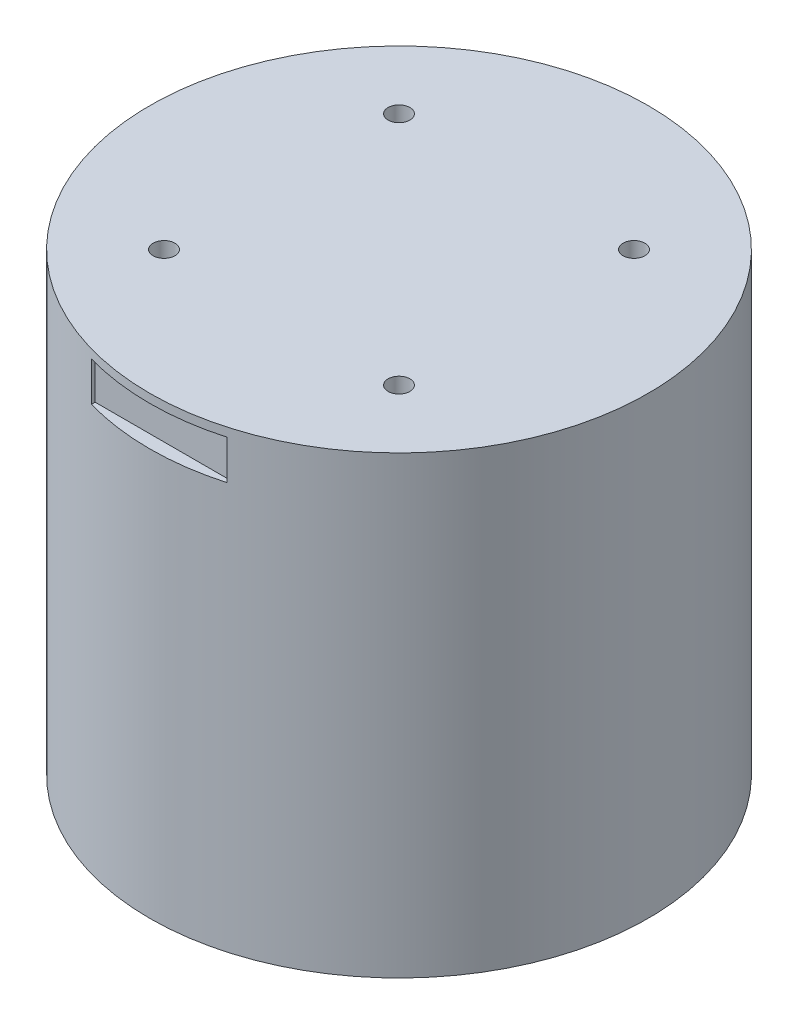
ISO-10303-21;
HEADER;
FILE_DESCRIPTION(('STEP AP214'),'2;1');
FILE_NAME('part.step','',(''),(''),'','','');
FILE_SCHEMA(('AUTOMOTIVE_DESIGN { 1 0 10303 214 1 1 1 1 }'));
ENDSEC;
DATA;
#1=APPLICATION_CONTEXT('core data for automotive mechanical design processes');
#2=APPLICATION_PROTOCOL_DEFINITION('international standard','automotive_design',2000,#1);
#3=PRODUCT_CONTEXT('',#1,'mechanical');
#4=PRODUCT('Part','Part','',(#3));
#5=PRODUCT_RELATED_PRODUCT_CATEGORY('part','',(#4));
#6=PRODUCT_DEFINITION_FORMATION('','',#4);
#7=PRODUCT_DEFINITION_CONTEXT('part definition',#1,'design');
#8=PRODUCT_DEFINITION('design','',#6,#7);
#9=PRODUCT_DEFINITION_SHAPE('','',#8);
#10=(LENGTH_UNIT() NAMED_UNIT(*) SI_UNIT(.MILLI.,.METRE.));
#11=(NAMED_UNIT(*) PLANE_ANGLE_UNIT() SI_UNIT($,.RADIAN.));
#12=(NAMED_UNIT(*) SI_UNIT($,.STERADIAN.) SOLID_ANGLE_UNIT());
#13=UNCERTAINTY_MEASURE_WITH_UNIT(LENGTH_MEASURE(1.E-05),#10,'distance_accuracy_value','');
#14=(GEOMETRIC_REPRESENTATION_CONTEXT(3) GLOBAL_UNCERTAINTY_ASSIGNED_CONTEXT((#13)) GLOBAL_UNIT_ASSIGNED_CONTEXT((#10,
#11,#12)) REPRESENTATION_CONTEXT('',''));
#15=CARTESIAN_POINT('',(0.,0.,0.));
#16=DIRECTION('',(0.,0.,1.));
#17=DIRECTION('',(1.,0.,0.));
#18=AXIS2_PLACEMENT_3D('',#15,#16,#17);
#19=CARTESIAN_POINT('',(0.,52.,0.));
#20=DIRECTION('',(0.,-1.,0.));
#21=DIRECTION('',(0.,0.,-1.));
#22=AXIS2_PLACEMENT_3D('',#19,#20,#21);
#23=CYLINDRICAL_SURFACE('',#22,28.5);
#24=CARTESIAN_POINT('',(0.,51.,0.));
#25=DIRECTION('',(0.,1.,0.));
#26=DIRECTION('',(0.,0.,1.));
#27=AXIS2_PLACEMENT_3D('',#24,#25,#26);
#28=CIRCLE('',#27,28.5);
#29=CARTESIAN_POINT('',(-7.75,51.,27.4260368992678));
#30=VERTEX_POINT('',#29);
#31=CARTESIAN_POINT('',(7.75,51.,27.4260368992678));
#32=VERTEX_POINT('',#31);
#33=EDGE_CURVE('E197',#30,#32,#28,.T.);
#34=ORIENTED_EDGE('',*,*,#33,.T.);
#35=DIRECTION('',(0.,-1.,0.));
#36=VECTOR('',#35,1.);
#37=CARTESIAN_POINT('',(7.75,52.,27.4260368992678));
#38=LINE('',#37,#36);
#39=CARTESIAN_POINT('',(7.75,46.5,27.4260368992678));
#40=VERTEX_POINT('',#39);
#41=EDGE_CURVE('E12',#32,#40,#38,.T.);
#42=ORIENTED_EDGE('',*,*,#41,.T.);
#43=CARTESIAN_POINT('',(0.,46.5,0.));
#44=DIRECTION('',(0.,-1.,0.));
#45=DIRECTION('',(0.,0.,-1.));
#46=AXIS2_PLACEMENT_3D('',#43,#44,#45);
#47=CIRCLE('',#46,28.5);
#48=CARTESIAN_POINT('',(-7.75,46.5,27.4260368992678));
#49=VERTEX_POINT('',#48);
#50=EDGE_CURVE('E56',#40,#49,#47,.T.);
#51=ORIENTED_EDGE('',*,*,#50,.T.);
#52=DIRECTION('',(0.,-1.,0.));
#53=VECTOR('',#52,1.);
#54=CARTESIAN_POINT('',(-7.75,52.,27.4260368992678));
#55=LINE('',#54,#53);
#56=EDGE_CURVE('E70',#49,#30,#55,.F.);
#57=ORIENTED_EDGE('',*,*,#56,.T.);
#58=EDGE_LOOP('',(#34,#42,#51,#57));
#59=FACE_BOUND('',#58,.T.);
#60=CARTESIAN_POINT('',(0.,52.,0.));
#61=DIRECTION('',(0.,1.,0.));
#62=DIRECTION('',(0.,0.,1.));
#63=AXIS2_PLACEMENT_3D('',#60,#61,#62);
#64=CIRCLE('',#63,28.5);
#65=CARTESIAN_POINT('',(0.,52.,28.5));
#66=VERTEX_POINT('',#65);
#67=EDGE_CURVE('E198',#66,#66,#64,.T.);
#68=ORIENTED_EDGE('',*,*,#67,.F.);
#69=EDGE_LOOP('',(#68));
#70=FACE_BOUND('',#69,.T.);
#71=CARTESIAN_POINT('',(0.,0.,0.));
#72=DIRECTION('',(0.,1.,0.));
#73=DIRECTION('',(0.,0.,1.));
#74=AXIS2_PLACEMENT_3D('',#71,#72,#73);
#75=CIRCLE('',#74,28.5);
#76=CARTESIAN_POINT('',(0.,0.,28.5));
#77=VERTEX_POINT('',#76);
#78=EDGE_CURVE('E193',#77,#77,#75,.T.);
#79=ORIENTED_EDGE('',*,*,#78,.T.);
#80=EDGE_LOOP('',(#79));
#81=FACE_BOUND('',#80,.T.);
#82=ADVANCED_FACE('F48',(#59,#70,#81),#23,.T.);
#83=CARTESIAN_POINT('',(0.,52.,0.));
#84=DIRECTION('',(0.,1.,0.));
#85=DIRECTION('',(0.,0.,1.));
#86=AXIS2_PLACEMENT_3D('',#83,#84,#85);
#87=PLANE('',#86);
#88=CARTESIAN_POINT('',(-13.4350288425443,52.,-13.4350288425445));
#89=DIRECTION('',(0.,1.,0.));
#90=DIRECTION('',(0.,0.,1.));
#91=AXIS2_PLACEMENT_3D('',#88,#89,#90);
#92=CIRCLE('',#91,1.25);
#93=CARTESIAN_POINT('',(-13.4350288425443,52.,-12.1850288425445));
#94=VERTEX_POINT('',#93);
#95=EDGE_CURVE('E649',#94,#94,#92,.T.);
#96=ORIENTED_EDGE('',*,*,#95,.F.);
#97=EDGE_LOOP('',(#96));
#98=FACE_BOUND('',#97,.T.);
#99=CARTESIAN_POINT('',(-13.4350288425445,52.,13.4350288425443));
#100=DIRECTION('',(0.,1.,0.));
#101=DIRECTION('',(0.,0.,1.));
#102=AXIS2_PLACEMENT_3D('',#99,#100,#101);
#103=CIRCLE('',#102,1.25);
#104=CARTESIAN_POINT('',(-13.4350288425445,52.,14.6850288425443));
#105=VERTEX_POINT('',#104);
#106=EDGE_CURVE('E657',#105,#105,#103,.T.);
#107=ORIENTED_EDGE('',*,*,#106,.F.);
#108=EDGE_LOOP('',(#107));
#109=FACE_BOUND('',#108,.T.);
#110=CARTESIAN_POINT('',(13.4350288425444,52.,13.4350288425444));
#111=DIRECTION('',(0.,1.,0.));
#112=DIRECTION('',(0.,0.,1.));
#113=AXIS2_PLACEMENT_3D('',#110,#111,#112);
#114=CIRCLE('',#113,1.25);
#115=CARTESIAN_POINT('',(13.4350288425444,52.,14.6850288425444));
#116=VERTEX_POINT('',#115);
#117=EDGE_CURVE('E663',#116,#116,#114,.T.);
#118=ORIENTED_EDGE('',*,*,#117,.F.);
#119=EDGE_LOOP('',(#118));
#120=FACE_BOUND('',#119,.T.);
#121=CARTESIAN_POINT('',(13.4350288425444,52.,-13.4350288425444));
#122=DIRECTION('',(0.,1.,0.));
#123=DIRECTION('',(0.,0.,1.));
#124=AXIS2_PLACEMENT_3D('',#121,#122,#123);
#125=CIRCLE('',#124,1.25);
#126=CARTESIAN_POINT('',(13.4350288425444,52.,-12.1850288425444));
#127=VERTEX_POINT('',#126);
#128=EDGE_CURVE('E113',#127,#127,#125,.T.);
#129=ORIENTED_EDGE('',*,*,#128,.F.);
#130=EDGE_LOOP('',(#129));
#131=FACE_BOUND('',#130,.T.);
#132=ORIENTED_EDGE('',*,*,#67,.T.);
#133=EDGE_LOOP('',(#132));
#134=FACE_BOUND('',#133,.T.);
#135=ADVANCED_FACE('F231',(#98,#109,#120,#131,#134),#87,.T.);
#136=CARTESIAN_POINT('',(0.,0.,0.));
#137=DIRECTION('',(0.,1.,0.));
#138=DIRECTION('',(0.,0.,1.));
#139=AXIS2_PLACEMENT_3D('',#136,#137,#138);
#140=PLANE('',#139);
#141=CARTESIAN_POINT('',(0.,0.,25.));
#142=DIRECTION('',(0.,-1.,0.));
#143=DIRECTION('',(0.,0.,-1.));
#144=AXIS2_PLACEMENT_3D('',#141,#142,#143);
#145=CIRCLE('',#144,1.25);
#146=CARTESIAN_POINT('',(0.,0.,23.75));
#147=VERTEX_POINT('',#146);
#148=EDGE_CURVE('E129',#147,#147,#145,.T.);
#149=ORIENTED_EDGE('',*,*,#148,.F.);
#150=EDGE_LOOP('',(#149));
#151=FACE_BOUND('',#150,.T.);
#152=CARTESIAN_POINT('',(-21.6506350946108,0.,12.5000000000003));
#153=DIRECTION('',(0.,-1.,0.));
#154=DIRECTION('',(0.,0.,-1.));
#155=AXIS2_PLACEMENT_3D('',#152,#153,#154);
#156=CIRCLE('',#155,1.25);
#157=CARTESIAN_POINT('',(-21.6506350946108,0.,11.2500000000003));
#158=VERTEX_POINT('',#157);
#159=EDGE_CURVE('E133',#158,#158,#156,.T.);
#160=ORIENTED_EDGE('',*,*,#159,.F.);
#161=EDGE_LOOP('',(#160));
#162=FACE_BOUND('',#161,.T.);
#163=CARTESIAN_POINT('',(-21.6506350946111,0.,-12.4999999999998));
#164=DIRECTION('',(0.,-1.,0.));
#165=DIRECTION('',(0.,0.,-1.));
#166=AXIS2_PLACEMENT_3D('',#163,#164,#165);
#167=CIRCLE('',#166,1.25);
#168=CARTESIAN_POINT('',(-21.6506350946111,0.,-13.7499999999998));
#169=VERTEX_POINT('',#168);
#170=EDGE_CURVE('E156',#169,#169,#167,.T.);
#171=ORIENTED_EDGE('',*,*,#170,.F.);
#172=EDGE_LOOP('',(#171));
#173=FACE_BOUND('',#172,.T.);
#174=CARTESIAN_POINT('',(-1.74574066942157E-13,0.,-25.));
#175=DIRECTION('',(0.,-1.,0.));
#176=DIRECTION('',(0.,0.,-1.));
#177=AXIS2_PLACEMENT_3D('',#174,#175,#176);
#178=CIRCLE('',#177,1.25);
#179=CARTESIAN_POINT('',(-1.74574066942157E-13,0.,-26.25));
#180=VERTEX_POINT('',#179);
#181=EDGE_CURVE('E150',#180,#180,#178,.T.);
#182=ORIENTED_EDGE('',*,*,#181,.F.);
#183=EDGE_LOOP('',(#182));
#184=FACE_BOUND('',#183,.T.);
#185=CARTESIAN_POINT('',(21.6506350946109,0.,-12.5000000000001));
#186=DIRECTION('',(0.,-1.,0.));
#187=DIRECTION('',(0.,0.,-1.));
#188=AXIS2_PLACEMENT_3D('',#185,#186,#187);
#189=CIRCLE('',#188,1.25);
#190=CARTESIAN_POINT('',(21.6506350946109,0.,-13.7500000000001));
#191=VERTEX_POINT('',#190);
#192=EDGE_CURVE('E144',#191,#191,#189,.T.);
#193=ORIENTED_EDGE('',*,*,#192,.F.);
#194=EDGE_LOOP('',(#193));
#195=FACE_BOUND('',#194,.T.);
#196=CARTESIAN_POINT('',(21.650635094611,0.,12.5));
#197=DIRECTION('',(0.,-1.,0.));
#198=DIRECTION('',(0.,0.,-1.));
#199=AXIS2_PLACEMENT_3D('',#196,#197,#198);
#200=CIRCLE('',#199,1.25);
#201=CARTESIAN_POINT('',(21.650635094611,0.,11.25));
#202=VERTEX_POINT('',#201);
#203=EDGE_CURVE('E132',#202,#202,#200,.T.);
#204=ORIENTED_EDGE('',*,*,#203,.F.);
#205=EDGE_LOOP('',(#204));
#206=FACE_BOUND('',#205,.T.);
#207=CARTESIAN_POINT('',(0.,0.,0.));
#208=DIRECTION('',(0.,-1.,0.));
#209=DIRECTION('',(0.,0.,-1.));
#210=AXIS2_PLACEMENT_3D('',#207,#208,#209);
#211=CIRCLE('',#210,17.5);
#212=CARTESIAN_POINT('',(0.,0.,-17.5));
#213=VERTEX_POINT('',#212);
#214=EDGE_CURVE('E194',#213,#213,#211,.T.);
#215=ORIENTED_EDGE('',*,*,#214,.F.);
#216=EDGE_LOOP('',(#215));
#217=FACE_BOUND('',#216,.T.);
#218=ORIENTED_EDGE('',*,*,#78,.F.);
#219=EDGE_LOOP('',(#218));
#220=FACE_BOUND('',#219,.T.);
#221=ADVANCED_FACE('F237',(#151,#162,#173,#184,#195,#206,#217,#220),#140,.F.);
#222=CARTESIAN_POINT('',(0.,-1.,0.));
#223=DIRECTION('',(0.,1.,0.));
#224=DIRECTION('',(0.,0.,1.));
#225=AXIS2_PLACEMENT_3D('',#222,#223,#224);
#226=CYLINDRICAL_SURFACE('',#225,17.5);
#227=CARTESIAN_POINT('',(0.,-1.,0.));
#228=DIRECTION('',(0.,-1.,0.));
#229=DIRECTION('',(0.,0.,-1.));
#230=AXIS2_PLACEMENT_3D('',#227,#228,#229);
#231=CIRCLE('',#230,17.5);
#232=CARTESIAN_POINT('',(0.,-1.,-17.5));
#233=VERTEX_POINT('',#232);
#234=EDGE_CURVE('E190',#233,#233,#231,.T.);
#235=ORIENTED_EDGE('',*,*,#234,.F.);
#236=EDGE_LOOP('',(#235));
#237=FACE_BOUND('',#236,.T.);
#238=ORIENTED_EDGE('',*,*,#214,.T.);
#239=EDGE_LOOP('',(#238));
#240=FACE_BOUND('',#239,.T.);
#241=ADVANCED_FACE('F286',(#237,#240),#226,.T.);
#242=CARTESIAN_POINT('',(0.,-1.,0.));
#243=DIRECTION('',(0.,-1.,0.));
#244=DIRECTION('',(0.,0.,-1.));
#245=AXIS2_PLACEMENT_3D('',#242,#243,#244);
#246=PLANE('',#245);
#247=CARTESIAN_POINT('',(0.,-1.,13.5));
#248=DIRECTION('',(0.,-1.,0.));
#249=DIRECTION('',(0.,0.,-1.));
#250=AXIS2_PLACEMENT_3D('',#247,#248,#249);
#251=CIRCLE('',#250,1.25);
#252=CARTESIAN_POINT('',(0.,-1.,12.25));
#253=VERTEX_POINT('',#252);
#254=EDGE_CURVE('E161',#253,#253,#251,.T.);
#255=ORIENTED_EDGE('',*,*,#254,.F.);
#256=EDGE_LOOP('',(#255));
#257=FACE_BOUND('',#256,.T.);
#258=CARTESIAN_POINT('',(0.,-1.,0.));
#259=DIRECTION('',(0.,-1.,0.));
#260=DIRECTION('',(0.,0.,-1.));
#261=AXIS2_PLACEMENT_3D('',#258,#259,#260);
#262=CIRCLE('',#261,4.75);
#263=CARTESIAN_POINT('',(0.,-1.,-4.75));
#264=VERTEX_POINT('',#263);
#265=EDGE_CURVE('E165',#264,#264,#262,.T.);
#266=ORIENTED_EDGE('',*,*,#265,.F.);
#267=EDGE_LOOP('',(#266));
#268=FACE_BOUND('',#267,.T.);
#269=CARTESIAN_POINT('',(11.6913429510899,-1.,6.74999999999997));
#270=DIRECTION('',(0.,-1.,0.));
#271=DIRECTION('',(0.,0.,-1.));
#272=AXIS2_PLACEMENT_3D('',#269,#270,#271);
#273=CIRCLE('',#272,1.25);
#274=CARTESIAN_POINT('',(11.6913429510899,-1.,5.49999999999998));
#275=VERTEX_POINT('',#274);
#276=EDGE_CURVE('E171',#275,#275,#273,.T.);
#277=ORIENTED_EDGE('',*,*,#276,.F.);
#278=EDGE_LOOP('',(#277));
#279=FACE_BOUND('',#278,.T.);
#280=CARTESIAN_POINT('',(11.6913429510899,-1.,-6.75000000000005));
#281=DIRECTION('',(0.,-1.,0.));
#282=DIRECTION('',(0.,0.,-1.));
#283=AXIS2_PLACEMENT_3D('',#280,#281,#282);
#284=CIRCLE('',#283,1.25);
#285=CARTESIAN_POINT('',(11.6913429510899,-1.,-8.00000000000006));
#286=VERTEX_POINT('',#285);
#287=EDGE_CURVE('E175',#286,#286,#284,.T.);
#288=ORIENTED_EDGE('',*,*,#287,.F.);
#289=EDGE_LOOP('',(#288));
#290=FACE_BOUND('',#289,.T.);
#291=CARTESIAN_POINT('',(0.,-1.,-13.5));
#292=DIRECTION('',(0.,-1.,0.));
#293=DIRECTION('',(0.,0.,-1.));
#294=AXIS2_PLACEMENT_3D('',#291,#292,#293);
#295=CIRCLE('',#294,1.25);
#296=CARTESIAN_POINT('',(0.,-1.,-14.75));
#297=VERTEX_POINT('',#296);
#298=EDGE_CURVE('E179',#297,#297,#295,.T.);
#299=ORIENTED_EDGE('',*,*,#298,.F.);
#300=EDGE_LOOP('',(#299));
#301=FACE_BOUND('',#300,.T.);
#302=CARTESIAN_POINT('',(-11.69134295109,-1.,-6.74999999999989));
#303=DIRECTION('',(0.,-1.,0.));
#304=DIRECTION('',(0.,0.,-1.));
#305=AXIS2_PLACEMENT_3D('',#302,#303,#304);
#306=CIRCLE('',#305,1.25);
#307=CARTESIAN_POINT('',(-11.69134295109,-1.,-7.99999999999989));
#308=VERTEX_POINT('',#307);
#309=EDGE_CURVE('E183',#308,#308,#306,.T.);
#310=ORIENTED_EDGE('',*,*,#309,.F.);
#311=EDGE_LOOP('',(#310));
#312=FACE_BOUND('',#311,.T.);
#313=CARTESIAN_POINT('',(-11.6913429510898,-1.,6.75000000000014));
#314=DIRECTION('',(0.,-1.,0.));
#315=DIRECTION('',(0.,0.,-1.));
#316=AXIS2_PLACEMENT_3D('',#313,#314,#315);
#317=CIRCLE('',#316,1.25);
#318=CARTESIAN_POINT('',(-11.6913429510898,-1.,5.50000000000014));
#319=VERTEX_POINT('',#318);
#320=EDGE_CURVE('E187',#319,#319,#317,.T.);
#321=ORIENTED_EDGE('',*,*,#320,.F.);
#322=EDGE_LOOP('',(#321));
#323=FACE_BOUND('',#322,.T.);
#324=ORIENTED_EDGE('',*,*,#234,.T.);
#325=EDGE_LOOP('',(#324));
#326=FACE_BOUND('',#325,.T.);
#327=ADVANCED_FACE('F283',(#257,#268,#279,#290,#301,#312,#323,#326),#246,.T.);
#328=CARTESIAN_POINT('',(-11.6913429510898,2.5,6.75000000000014));
#329=DIRECTION('',(0.,-1.,0.));
#330=DIRECTION('',(0.,0.,-1.));
#331=AXIS2_PLACEMENT_3D('',#328,#329,#330);
#332=CYLINDRICAL_SURFACE('',#331,1.25);
#333=CARTESIAN_POINT('',(-11.6913429510898,6.,6.75000000000014));
#334=DIRECTION('',(0.,-1.,0.));
#335=DIRECTION('',(0.,0.,-1.));
#336=AXIS2_PLACEMENT_3D('',#333,#334,#335);
#337=CIRCLE('',#336,1.25);
#338=CARTESIAN_POINT('',(-11.6913429510898,6.,5.50000000000014));
#339=VERTEX_POINT('',#338);
#340=EDGE_CURVE('E128',#339,#339,#337,.T.);
#341=ORIENTED_EDGE('',*,*,#340,.F.);
#342=EDGE_LOOP('',(#341));
#343=FACE_BOUND('',#342,.T.);
#344=ORIENTED_EDGE('',*,*,#320,.T.);
#345=EDGE_LOOP('',(#344));
#346=FACE_BOUND('',#345,.T.);
#347=ADVANCED_FACE('F260',(#343,#346),#332,.F.);
#348=CARTESIAN_POINT('',(-11.6913429510898,6.,6.75000000000014));
#349=DIRECTION('',(0.,-1.,0.));
#350=DIRECTION('',(0.,0.,-1.));
#351=AXIS2_PLACEMENT_3D('',#348,#349,#350);
#352=PLANE('',#351);
#353=ORIENTED_EDGE('',*,*,#340,.T.);
#354=EDGE_LOOP('',(#353));
#355=FACE_BOUND('',#354,.T.);
#356=ADVANCED_FACE('F258',(#355),#352,.T.);
#357=CARTESIAN_POINT('',(-11.69134295109,2.5,-6.74999999999989));
#358=DIRECTION('',(0.,-1.,0.));
#359=DIRECTION('',(0.,0.,-1.));
#360=AXIS2_PLACEMENT_3D('',#357,#358,#359);
#361=CYLINDRICAL_SURFACE('',#360,1.25);
#362=CARTESIAN_POINT('',(-11.69134295109,6.,-6.74999999999989));
#363=DIRECTION('',(0.,-1.,0.));
#364=DIRECTION('',(0.,0.,-1.));
#365=AXIS2_PLACEMENT_3D('',#362,#363,#364);
#366=CIRCLE('',#365,1.25);
#367=CARTESIAN_POINT('',(-11.69134295109,6.,-7.99999999999989));
#368=VERTEX_POINT('',#367);
#369=EDGE_CURVE('E186',#368,#368,#366,.T.);
#370=ORIENTED_EDGE('',*,*,#369,.F.);
#371=EDGE_LOOP('',(#370));
#372=FACE_BOUND('',#371,.T.);
#373=ORIENTED_EDGE('',*,*,#309,.T.);
#374=EDGE_LOOP('',(#373));
#375=FACE_BOUND('',#374,.T.);
#376=ADVANCED_FACE('F256',(#372,#375),#361,.F.);
#377=CARTESIAN_POINT('',(-11.69134295109,6.,-6.74999999999989));
#378=DIRECTION('',(0.,-1.,0.));
#379=DIRECTION('',(0.,0.,-1.));
#380=AXIS2_PLACEMENT_3D('',#377,#378,#379);
#381=PLANE('',#380);
#382=ORIENTED_EDGE('',*,*,#369,.T.);
#383=EDGE_LOOP('',(#382));
#384=FACE_BOUND('',#383,.T.);
#385=ADVANCED_FACE('F253',(#384),#381,.T.);
#386=CARTESIAN_POINT('',(0.,2.5,-13.5));
#387=DIRECTION('',(0.,-1.,0.));
#388=DIRECTION('',(0.,0.,-1.));
#389=AXIS2_PLACEMENT_3D('',#386,#387,#388);
#390=CYLINDRICAL_SURFACE('',#389,1.25);
#391=CARTESIAN_POINT('',(0.,6.,-13.5));
#392=DIRECTION('',(0.,-1.,0.));
#393=DIRECTION('',(0.,0.,-1.));
#394=AXIS2_PLACEMENT_3D('',#391,#392,#393);
#395=CIRCLE('',#394,1.25);
#396=CARTESIAN_POINT('',(0.,6.,-14.75));
#397=VERTEX_POINT('',#396);
#398=EDGE_CURVE('E182',#397,#397,#395,.T.);
#399=ORIENTED_EDGE('',*,*,#398,.F.);
#400=EDGE_LOOP('',(#399));
#401=FACE_BOUND('',#400,.T.);
#402=ORIENTED_EDGE('',*,*,#298,.T.);
#403=EDGE_LOOP('',(#402));
#404=FACE_BOUND('',#403,.T.);
#405=ADVANCED_FACE('F251',(#401,#404),#390,.F.);
#406=CARTESIAN_POINT('',(0.,6.,-13.5));
#407=DIRECTION('',(0.,-1.,0.));
#408=DIRECTION('',(0.,0.,-1.));
#409=AXIS2_PLACEMENT_3D('',#406,#407,#408);
#410=PLANE('',#409);
#411=ORIENTED_EDGE('',*,*,#398,.T.);
#412=EDGE_LOOP('',(#411));
#413=FACE_BOUND('',#412,.T.);
#414=ADVANCED_FACE('F248',(#413),#410,.T.);
#415=CARTESIAN_POINT('',(11.6913429510899,2.5,-6.75000000000005));
#416=DIRECTION('',(0.,-1.,0.));
#417=DIRECTION('',(0.,0.,-1.));
#418=AXIS2_PLACEMENT_3D('',#415,#416,#417);
#419=CYLINDRICAL_SURFACE('',#418,1.25);
#420=CARTESIAN_POINT('',(11.6913429510899,6.,-6.75000000000005));
#421=DIRECTION('',(0.,-1.,0.));
#422=DIRECTION('',(0.,0.,-1.));
#423=AXIS2_PLACEMENT_3D('',#420,#421,#422);
#424=CIRCLE('',#423,1.25);
#425=CARTESIAN_POINT('',(11.6913429510899,6.,-8.00000000000006));
#426=VERTEX_POINT('',#425);
#427=EDGE_CURVE('E178',#426,#426,#424,.T.);
#428=ORIENTED_EDGE('',*,*,#427,.F.);
#429=EDGE_LOOP('',(#428));
#430=FACE_BOUND('',#429,.T.);
#431=ORIENTED_EDGE('',*,*,#287,.T.);
#432=EDGE_LOOP('',(#431));
#433=FACE_BOUND('',#432,.T.);
#434=ADVANCED_FACE('F246',(#430,#433),#419,.F.);
#435=CARTESIAN_POINT('',(11.6913429510899,6.,-6.75000000000005));
#436=DIRECTION('',(0.,-1.,0.));
#437=DIRECTION('',(0.,0.,-1.));
#438=AXIS2_PLACEMENT_3D('',#435,#436,#437);
#439=PLANE('',#438);
#440=ORIENTED_EDGE('',*,*,#427,.T.);
#441=EDGE_LOOP('',(#440));
#442=FACE_BOUND('',#441,.T.);
#443=ADVANCED_FACE('F242',(#442),#439,.T.);
#444=CARTESIAN_POINT('',(11.6913429510899,2.5,6.74999999999997));
#445=DIRECTION('',(0.,-1.,0.));
#446=DIRECTION('',(0.,0.,-1.));
#447=AXIS2_PLACEMENT_3D('',#444,#445,#446);
#448=CYLINDRICAL_SURFACE('',#447,1.25);
#449=CARTESIAN_POINT('',(11.6913429510899,6.,6.74999999999997));
#450=DIRECTION('',(0.,-1.,0.));
#451=DIRECTION('',(0.,0.,-1.));
#452=AXIS2_PLACEMENT_3D('',#449,#450,#451);
#453=CIRCLE('',#452,1.25);
#454=CARTESIAN_POINT('',(11.6913429510899,6.,5.49999999999998));
#455=VERTEX_POINT('',#454);
#456=EDGE_CURVE('E174',#455,#455,#453,.T.);
#457=ORIENTED_EDGE('',*,*,#456,.F.);
#458=EDGE_LOOP('',(#457));
#459=FACE_BOUND('',#458,.T.);
#460=ORIENTED_EDGE('',*,*,#276,.T.);
#461=EDGE_LOOP('',(#460));
#462=FACE_BOUND('',#461,.T.);
#463=ADVANCED_FACE('F245',(#459,#462),#448,.F.);
#464=CARTESIAN_POINT('',(11.6913429510899,6.,6.74999999999997));
#465=DIRECTION('',(0.,-1.,0.));
#466=DIRECTION('',(0.,0.,-1.));
#467=AXIS2_PLACEMENT_3D('',#464,#465,#466);
#468=PLANE('',#467);
#469=ORIENTED_EDGE('',*,*,#456,.T.);
#470=EDGE_LOOP('',(#469));
#471=FACE_BOUND('',#470,.T.);
#472=ADVANCED_FACE('F50',(#471),#468,.T.);
#473=CARTESIAN_POINT('',(0.,2.5,0.));
#474=DIRECTION('',(0.,-1.,0.));
#475=DIRECTION('',(0.,0.,-1.));
#476=AXIS2_PLACEMENT_3D('',#473,#474,#475);
#477=CYLINDRICAL_SURFACE('',#476,4.75);
#478=CARTESIAN_POINT('',(0.,2.5,0.));
#479=DIRECTION('',(0.,-1.,0.));
#480=DIRECTION('',(0.,0.,-1.));
#481=AXIS2_PLACEMENT_3D('',#478,#479,#480);
#482=CIRCLE('',#481,4.75);
#483=CARTESIAN_POINT('',(0.,2.5,-4.75));
#484=VERTEX_POINT('',#483);
#485=EDGE_CURVE('E168',#484,#484,#482,.T.);
#486=ORIENTED_EDGE('',*,*,#485,.F.);
#487=EDGE_LOOP('',(#486));
#488=FACE_BOUND('',#487,.T.);
#489=ORIENTED_EDGE('',*,*,#265,.T.);
#490=EDGE_LOOP('',(#489));
#491=FACE_BOUND('',#490,.T.);
#492=ADVANCED_FACE('F360',(#488,#491),#477,.F.);
#493=CARTESIAN_POINT('',(0.,2.5,0.));
#494=DIRECTION('',(0.,-1.,0.));
#495=DIRECTION('',(0.,0.,-1.));
#496=AXIS2_PLACEMENT_3D('',#493,#494,#495);
#497=PLANE('',#496);
#498=ORIENTED_EDGE('',*,*,#485,.T.);
#499=EDGE_LOOP('',(#498));
#500=FACE_BOUND('',#499,.T.);
#501=ADVANCED_FACE('F276',(#500),#497,.T.);
#502=CARTESIAN_POINT('',(0.,2.5,13.5));
#503=DIRECTION('',(0.,-1.,0.));
#504=DIRECTION('',(0.,0.,-1.));
#505=AXIS2_PLACEMENT_3D('',#502,#503,#504);
#506=CYLINDRICAL_SURFACE('',#505,1.25);
#507=CARTESIAN_POINT('',(0.,6.,13.5));
#508=DIRECTION('',(0.,-1.,0.));
#509=DIRECTION('',(0.,0.,-1.));
#510=AXIS2_PLACEMENT_3D('',#507,#508,#509);
#511=CIRCLE('',#510,1.25);
#512=CARTESIAN_POINT('',(0.,6.,12.25));
#513=VERTEX_POINT('',#512);
#514=EDGE_CURVE('E164',#513,#513,#511,.T.);
#515=ORIENTED_EDGE('',*,*,#514,.F.);
#516=EDGE_LOOP('',(#515));
#517=FACE_BOUND('',#516,.T.);
#518=ORIENTED_EDGE('',*,*,#254,.T.);
#519=EDGE_LOOP('',(#518));
#520=FACE_BOUND('',#519,.T.);
#521=ADVANCED_FACE('F265',(#517,#520),#506,.F.);
#522=CARTESIAN_POINT('',(0.,6.,13.5));
#523=DIRECTION('',(0.,-1.,0.));
#524=DIRECTION('',(0.,0.,-1.));
#525=AXIS2_PLACEMENT_3D('',#522,#523,#524);
#526=PLANE('',#525);
#527=ORIENTED_EDGE('',*,*,#514,.T.);
#528=EDGE_LOOP('',(#527));
#529=FACE_BOUND('',#528,.T.);
#530=ADVANCED_FACE('F262',(#529),#526,.T.);
#531=CARTESIAN_POINT('',(21.650635094611,5.,12.5));
#532=DIRECTION('',(0.,-1.,0.));
#533=DIRECTION('',(0.,0.,-1.));
#534=AXIS2_PLACEMENT_3D('',#531,#532,#533);
#535=CYLINDRICAL_SURFACE('',#534,1.25);
#536=CARTESIAN_POINT('',(21.650635094611,5.,12.5));
#537=DIRECTION('',(0.,-1.,0.));
#538=DIRECTION('',(0.,0.,-1.));
#539=AXIS2_PLACEMENT_3D('',#536,#537,#538);
#540=CIRCLE('',#539,1.25);
#541=CARTESIAN_POINT('',(21.650635094611,5.,11.25));
#542=VERTEX_POINT('',#541);
#543=EDGE_CURVE('E141',#542,#542,#540,.T.);
#544=ORIENTED_EDGE('',*,*,#543,.F.);
#545=EDGE_LOOP('',(#544));
#546=FACE_BOUND('',#545,.T.);
#547=ORIENTED_EDGE('',*,*,#203,.T.);
#548=EDGE_LOOP('',(#547));
#549=FACE_BOUND('',#548,.T.);
#550=ADVANCED_FACE('F264',(#546,#549),#535,.F.);
#551=CARTESIAN_POINT('',(21.650635094611,5.,12.5));
#552=DIRECTION('',(0.,-1.,0.));
#553=DIRECTION('',(0.,0.,-1.));
#554=AXIS2_PLACEMENT_3D('',#551,#552,#553);
#555=PLANE('',#554);
#556=ORIENTED_EDGE('',*,*,#543,.T.);
#557=EDGE_LOOP('',(#556));
#558=FACE_BOUND('',#557,.T.);
#559=ADVANCED_FACE('F272',(#558),#555,.T.);
#560=CARTESIAN_POINT('',(21.6506350946109,5.,-12.5000000000001));
#561=DIRECTION('',(0.,-1.,0.));
#562=DIRECTION('',(0.,0.,-1.));
#563=AXIS2_PLACEMENT_3D('',#560,#561,#562);
#564=CYLINDRICAL_SURFACE('',#563,1.25);
#565=CARTESIAN_POINT('',(21.6506350946109,5.,-12.5000000000001));
#566=DIRECTION('',(0.,-1.,0.));
#567=DIRECTION('',(0.,0.,-1.));
#568=AXIS2_PLACEMENT_3D('',#565,#566,#567);
#569=CIRCLE('',#568,1.25);
#570=CARTESIAN_POINT('',(21.6506350946109,5.,-13.7500000000001));
#571=VERTEX_POINT('',#570);
#572=EDGE_CURVE('E147',#571,#571,#569,.T.);
#573=ORIENTED_EDGE('',*,*,#572,.F.);
#574=EDGE_LOOP('',(#573));
#575=FACE_BOUND('',#574,.T.);
#576=ORIENTED_EDGE('',*,*,#192,.T.);
#577=EDGE_LOOP('',(#576));
#578=FACE_BOUND('',#577,.T.);
#579=ADVANCED_FACE('F327',(#575,#578),#564,.F.);
#580=CARTESIAN_POINT('',(21.6506350946109,5.,-12.5000000000001));
#581=DIRECTION('',(0.,-1.,0.));
#582=DIRECTION('',(0.,0.,-1.));
#583=AXIS2_PLACEMENT_3D('',#580,#581,#582);
#584=PLANE('',#583);
#585=ORIENTED_EDGE('',*,*,#572,.T.);
#586=EDGE_LOOP('',(#585));
#587=FACE_BOUND('',#586,.T.);
#588=ADVANCED_FACE('F329',(#587),#584,.T.);
#589=CARTESIAN_POINT('',(-1.74574066942157E-13,5.,-25.));
#590=DIRECTION('',(0.,-1.,0.));
#591=DIRECTION('',(0.,0.,-1.));
#592=AXIS2_PLACEMENT_3D('',#589,#590,#591);
#593=CYLINDRICAL_SURFACE('',#592,1.25);
#594=CARTESIAN_POINT('',(-1.74574066942157E-13,5.,-25.));
#595=DIRECTION('',(0.,-1.,0.));
#596=DIRECTION('',(0.,0.,-1.));
#597=AXIS2_PLACEMENT_3D('',#594,#595,#596);
#598=CIRCLE('',#597,1.25);
#599=CARTESIAN_POINT('',(-1.74574066942157E-13,5.,-26.25));
#600=VERTEX_POINT('',#599);
#601=EDGE_CURVE('E153',#600,#600,#598,.T.);
#602=ORIENTED_EDGE('',*,*,#601,.F.);
#603=EDGE_LOOP('',(#602));
#604=FACE_BOUND('',#603,.T.);
#605=ORIENTED_EDGE('',*,*,#181,.T.);
#606=EDGE_LOOP('',(#605));
#607=FACE_BOUND('',#606,.T.);
#608=ADVANCED_FACE('F336',(#604,#607),#593,.F.);
#609=CARTESIAN_POINT('',(-1.74574066942157E-13,5.,-25.));
#610=DIRECTION('',(0.,-1.,0.));
#611=DIRECTION('',(0.,0.,-1.));
#612=AXIS2_PLACEMENT_3D('',#609,#610,#611);
#613=PLANE('',#612);
#614=ORIENTED_EDGE('',*,*,#601,.T.);
#615=EDGE_LOOP('',(#614));
#616=FACE_BOUND('',#615,.T.);
#617=ADVANCED_FACE('F346',(#616),#613,.T.);
#618=CARTESIAN_POINT('',(-21.6506350946111,5.,-12.4999999999998));
#619=DIRECTION('',(0.,-1.,0.));
#620=DIRECTION('',(0.,0.,-1.));
#621=AXIS2_PLACEMENT_3D('',#618,#619,#620);
#622=CYLINDRICAL_SURFACE('',#621,1.25);
#623=CARTESIAN_POINT('',(-21.6506350946111,5.,-12.4999999999998));
#624=DIRECTION('',(0.,-1.,0.));
#625=DIRECTION('',(0.,0.,-1.));
#626=AXIS2_PLACEMENT_3D('',#623,#624,#625);
#627=CIRCLE('',#626,1.25);
#628=CARTESIAN_POINT('',(-21.6506350946111,5.,-13.7499999999998));
#629=VERTEX_POINT('',#628);
#630=EDGE_CURVE('E136',#629,#629,#627,.T.);
#631=ORIENTED_EDGE('',*,*,#630,.F.);
#632=EDGE_LOOP('',(#631));
#633=FACE_BOUND('',#632,.T.);
#634=ORIENTED_EDGE('',*,*,#170,.T.);
#635=EDGE_LOOP('',(#634));
#636=FACE_BOUND('',#635,.T.);
#637=ADVANCED_FACE('F350',(#633,#636),#622,.F.);
#638=CARTESIAN_POINT('',(-21.6506350946111,5.,-12.4999999999998));
#639=DIRECTION('',(0.,-1.,0.));
#640=DIRECTION('',(0.,0.,-1.));
#641=AXIS2_PLACEMENT_3D('',#638,#639,#640);
#642=PLANE('',#641);
#643=ORIENTED_EDGE('',*,*,#630,.T.);
#644=EDGE_LOOP('',(#643));
#645=FACE_BOUND('',#644,.T.);
#646=ADVANCED_FACE('F354',(#645),#642,.T.);
#647=CARTESIAN_POINT('',(-21.6506350946108,5.,12.5000000000003));
#648=DIRECTION('',(0.,-1.,0.));
#649=DIRECTION('',(0.,0.,-1.));
#650=AXIS2_PLACEMENT_3D('',#647,#648,#649);
#651=CYLINDRICAL_SURFACE('',#650,1.25);
#652=CARTESIAN_POINT('',(-21.6506350946108,5.,12.5000000000003));
#653=DIRECTION('',(0.,-1.,0.));
#654=DIRECTION('',(0.,0.,-1.));
#655=AXIS2_PLACEMENT_3D('',#652,#653,#654);
#656=CIRCLE('',#655,1.25);
#657=CARTESIAN_POINT('',(-21.6506350946108,5.,11.2500000000003));
#658=VERTEX_POINT('',#657);
#659=EDGE_CURVE('E121',#658,#658,#656,.T.);
#660=ORIENTED_EDGE('',*,*,#659,.F.);
#661=EDGE_LOOP('',(#660));
#662=FACE_BOUND('',#661,.T.);
#663=ORIENTED_EDGE('',*,*,#159,.T.);
#664=EDGE_LOOP('',(#663));
#665=FACE_BOUND('',#664,.T.);
#666=ADVANCED_FACE('F357',(#662,#665),#651,.F.);
#667=CARTESIAN_POINT('',(-21.6506350946108,5.,12.5000000000003));
#668=DIRECTION('',(0.,-1.,0.));
#669=DIRECTION('',(0.,0.,-1.));
#670=AXIS2_PLACEMENT_3D('',#667,#668,#669);
#671=PLANE('',#670);
#672=ORIENTED_EDGE('',*,*,#659,.T.);
#673=EDGE_LOOP('',(#672));
#674=FACE_BOUND('',#673,.T.);
#675=ADVANCED_FACE('F397',(#674),#671,.T.);
#676=CARTESIAN_POINT('',(0.,5.,25.));
#677=DIRECTION('',(0.,-1.,0.));
#678=DIRECTION('',(0.,0.,-1.));
#679=AXIS2_PLACEMENT_3D('',#676,#677,#678);
#680=CYLINDRICAL_SURFACE('',#679,1.25);
#681=CARTESIAN_POINT('',(0.,5.,25.));
#682=DIRECTION('',(0.,-1.,0.));
#683=DIRECTION('',(0.,0.,-1.));
#684=AXIS2_PLACEMENT_3D('',#681,#682,#683);
#685=CIRCLE('',#684,1.25);
#686=CARTESIAN_POINT('',(0.,5.,23.75));
#687=VERTEX_POINT('',#686);
#688=EDGE_CURVE('E125',#687,#687,#685,.T.);
#689=ORIENTED_EDGE('',*,*,#688,.F.);
#690=EDGE_LOOP('',(#689));
#691=FACE_BOUND('',#690,.T.);
#692=ORIENTED_EDGE('',*,*,#148,.T.);
#693=EDGE_LOOP('',(#692));
#694=FACE_BOUND('',#693,.T.);
#695=ADVANCED_FACE('F545',(#691,#694),#680,.F.);
#696=CARTESIAN_POINT('',(0.,5.,25.));
#697=DIRECTION('',(0.,-1.,0.));
#698=DIRECTION('',(0.,0.,-1.));
#699=AXIS2_PLACEMENT_3D('',#696,#697,#698);
#700=PLANE('',#699);
#701=ORIENTED_EDGE('',*,*,#688,.T.);
#702=EDGE_LOOP('',(#701));
#703=FACE_BOUND('',#702,.T.);
#704=ADVANCED_FACE('F227',(#703),#700,.T.);
#705=CARTESIAN_POINT('',(7.75,46.5,27.));
#706=DIRECTION('',(1.,0.,0.));
#707=DIRECTION('',(0.,0.,-1.));
#708=AXIS2_PLACEMENT_3D('',#705,#706,#707);
#709=PLANE('',#708);
#710=DIRECTION('',(0.,0.,1.));
#711=VECTOR('',#710,1.);
#712=CARTESIAN_POINT('',(7.75,51.,27.));
#713=LINE('',#712,#711);
#714=CARTESIAN_POINT('',(7.75,51.,27.));
#715=VERTEX_POINT('',#714);
#716=EDGE_CURVE('E90',#715,#32,#713,.T.);
#717=ORIENTED_EDGE('',*,*,#716,.F.);
#718=DIRECTION('',(0.,1.,0.));
#719=VECTOR('',#718,1.);
#720=CARTESIAN_POINT('',(7.75,46.5,27.));
#721=LINE('',#720,#719);
#722=CARTESIAN_POINT('',(7.75,46.5,27.));
#723=VERTEX_POINT('',#722);
#724=EDGE_CURVE('E94',#723,#715,#721,.T.);
#725=ORIENTED_EDGE('',*,*,#724,.F.);
#726=DIRECTION('',(0.,0.,1.));
#727=VECTOR('',#726,1.);
#728=CARTESIAN_POINT('',(7.75,46.5,27.));
#729=LINE('',#728,#727);
#730=EDGE_CURVE('E119',#723,#40,#729,.T.);
#731=ORIENTED_EDGE('',*,*,#730,.T.);
#732=ORIENTED_EDGE('',*,*,#41,.F.);
#733=EDGE_LOOP('',(#717,#725,#731,#732));
#734=FACE_BOUND('',#733,.T.);
#735=ADVANCED_FACE('F92',(#734),#709,.F.);
#736=CARTESIAN_POINT('',(-7.75,46.5,27.));
#737=DIRECTION('',(0.,-1.,0.));
#738=DIRECTION('',(0.,0.,-1.));
#739=AXIS2_PLACEMENT_3D('',#736,#737,#738);
#740=PLANE('',#739);
#741=ORIENTED_EDGE('',*,*,#730,.F.);
#742=DIRECTION('',(1.,0.,0.));
#743=VECTOR('',#742,1.);
#744=CARTESIAN_POINT('',(-7.75,46.5,27.));
#745=LINE('',#744,#743);
#746=CARTESIAN_POINT('',(-7.75,46.5,27.));
#747=VERTEX_POINT('',#746);
#748=EDGE_CURVE('E98',#747,#723,#745,.T.);
#749=ORIENTED_EDGE('',*,*,#748,.F.);
#750=DIRECTION('',(0.,0.,1.));
#751=VECTOR('',#750,1.);
#752=CARTESIAN_POINT('',(-7.75,46.5,27.));
#753=LINE('',#752,#751);
#754=EDGE_CURVE('E122',#747,#49,#753,.T.);
#755=ORIENTED_EDGE('',*,*,#754,.T.);
#756=ORIENTED_EDGE('',*,*,#50,.F.);
#757=EDGE_LOOP('',(#741,#749,#755,#756));
#758=FACE_BOUND('',#757,.T.);
#759=ADVANCED_FACE('F219',(#758),#740,.F.);
#760=CARTESIAN_POINT('',(-7.75,46.5,27.));
#761=DIRECTION('',(-1.,0.,0.));
#762=DIRECTION('',(0.,0.,1.));
#763=AXIS2_PLACEMENT_3D('',#760,#761,#762);
#764=PLANE('',#763);
#765=ORIENTED_EDGE('',*,*,#754,.F.);
#766=DIRECTION('',(0.,-1.,0.));
#767=VECTOR('',#766,1.);
#768=CARTESIAN_POINT('',(-7.75,46.5,27.));
#769=LINE('',#768,#767);
#770=CARTESIAN_POINT('',(-7.75,51.,27.));
#771=VERTEX_POINT('',#770);
#772=EDGE_CURVE('E106',#771,#747,#769,.T.);
#773=ORIENTED_EDGE('',*,*,#772,.F.);
#774=DIRECTION('',(0.,0.,1.));
#775=VECTOR('',#774,1.);
#776=CARTESIAN_POINT('',(-7.75,51.,27.));
#777=LINE('',#776,#775);
#778=EDGE_CURVE('E97',#771,#30,#777,.T.);
#779=ORIENTED_EDGE('',*,*,#778,.T.);
#780=ORIENTED_EDGE('',*,*,#56,.F.);
#781=EDGE_LOOP('',(#765,#773,#779,#780));
#782=FACE_BOUND('',#781,.T.);
#783=ADVANCED_FACE('F218',(#782),#764,.F.);
#784=CARTESIAN_POINT('',(-7.75,51.,27.));
#785=DIRECTION('',(0.,1.,0.));
#786=DIRECTION('',(0.,0.,1.));
#787=AXIS2_PLACEMENT_3D('',#784,#785,#786);
#788=PLANE('',#787);
#789=ORIENTED_EDGE('',*,*,#33,.F.);
#790=ORIENTED_EDGE('',*,*,#778,.F.);
#791=DIRECTION('',(-1.,0.,0.));
#792=VECTOR('',#791,1.);
#793=CARTESIAN_POINT('',(-7.75,51.,27.));
#794=LINE('',#793,#792);
#795=EDGE_CURVE('E101',#715,#771,#794,.T.);
#796=ORIENTED_EDGE('',*,*,#795,.F.);
#797=ORIENTED_EDGE('',*,*,#716,.T.);
#798=EDGE_LOOP('',(#789,#790,#796,#797));
#799=FACE_BOUND('',#798,.T.);
#800=ADVANCED_FACE('F102',(#799),#788,.F.);
#801=CARTESIAN_POINT('',(0.,0.,27.));
#802=DIRECTION('',(0.,0.,-1.));
#803=DIRECTION('',(-1.,0.,0.));
#804=AXIS2_PLACEMENT_3D('',#801,#802,#803);
#805=PLANE('',#804);
#806=ORIENTED_EDGE('',*,*,#724,.T.);
#807=ORIENTED_EDGE('',*,*,#795,.T.);
#808=ORIENTED_EDGE('',*,*,#772,.T.);
#809=ORIENTED_EDGE('',*,*,#748,.T.);
#810=EDGE_LOOP('',(#806,#807,#808,#809));
#811=FACE_BOUND('',#810,.T.);
#812=ADVANCED_FACE('F108',(#811),#805,.F.);
#813=CARTESIAN_POINT('',(13.4350288425444,47.,-13.4350288425444));
#814=DIRECTION('',(0.,1.,0.));
#815=DIRECTION('',(0.,0.,1.));
#816=AXIS2_PLACEMENT_3D('',#813,#814,#815);
#817=CYLINDRICAL_SURFACE('',#816,1.25);
#818=CARTESIAN_POINT('',(13.4350288425444,47.,-13.4350288425444));
#819=DIRECTION('',(0.,1.,0.));
#820=DIRECTION('',(0.,0.,1.));
#821=AXIS2_PLACEMENT_3D('',#818,#819,#820);
#822=CIRCLE('',#821,1.25);
#823=CARTESIAN_POINT('',(13.4350288425444,47.,-12.1850288425444));
#824=VERTEX_POINT('',#823);
#825=EDGE_CURVE('E110',#824,#824,#822,.T.);
#826=ORIENTED_EDGE('',*,*,#825,.F.);
#827=EDGE_LOOP('',(#826));
#828=FACE_BOUND('',#827,.T.);
#829=ORIENTED_EDGE('',*,*,#128,.T.);
#830=EDGE_LOOP('',(#829));
#831=FACE_BOUND('',#830,.T.);
#832=ADVANCED_FACE('F403',(#828,#831),#817,.F.);
#833=CARTESIAN_POINT('',(13.4350288425444,47.,-13.4350288425444));
#834=DIRECTION('',(0.,1.,0.));
#835=DIRECTION('',(0.,0.,1.));
#836=AXIS2_PLACEMENT_3D('',#833,#834,#835);
#837=PLANE('',#836);
#838=ORIENTED_EDGE('',*,*,#825,.T.);
#839=EDGE_LOOP('',(#838));
#840=FACE_BOUND('',#839,.T.);
#841=ADVANCED_FACE('F407',(#840),#837,.T.);
#842=CARTESIAN_POINT('',(13.4350288425444,47.,13.4350288425444));
#843=DIRECTION('',(0.,1.,0.));
#844=DIRECTION('',(0.,0.,1.));
#845=AXIS2_PLACEMENT_3D('',#842,#843,#844);
#846=CYLINDRICAL_SURFACE('',#845,1.25);
#847=CARTESIAN_POINT('',(13.4350288425444,47.,13.4350288425444));
#848=DIRECTION('',(0.,1.,0.));
#849=DIRECTION('',(0.,0.,1.));
#850=AXIS2_PLACEMENT_3D('',#847,#848,#849);
#851=CIRCLE('',#850,1.25);
#852=CARTESIAN_POINT('',(13.4350288425444,47.,14.6850288425444));
#853=VERTEX_POINT('',#852);
#854=EDGE_CURVE('E660',#853,#853,#851,.T.);
#855=ORIENTED_EDGE('',*,*,#854,.F.);
#856=EDGE_LOOP('',(#855));
#857=FACE_BOUND('',#856,.T.);
#858=ORIENTED_EDGE('',*,*,#117,.T.);
#859=EDGE_LOOP('',(#858));
#860=FACE_BOUND('',#859,.T.);
#861=ADVANCED_FACE('F435',(#857,#860),#846,.F.);
#862=CARTESIAN_POINT('',(13.4350288425444,47.,13.4350288425444));
#863=DIRECTION('',(0.,1.,0.));
#864=DIRECTION('',(0.,0.,1.));
#865=AXIS2_PLACEMENT_3D('',#862,#863,#864);
#866=PLANE('',#865);
#867=ORIENTED_EDGE('',*,*,#854,.T.);
#868=EDGE_LOOP('',(#867));
#869=FACE_BOUND('',#868,.T.);
#870=ADVANCED_FACE('F429',(#869),#866,.T.);
#871=CARTESIAN_POINT('',(-13.4350288425445,47.,13.4350288425443));
#872=DIRECTION('',(0.,1.,0.));
#873=DIRECTION('',(0.,0.,1.));
#874=AXIS2_PLACEMENT_3D('',#871,#872,#873);
#875=CYLINDRICAL_SURFACE('',#874,1.25);
#876=CARTESIAN_POINT('',(-13.4350288425445,47.,13.4350288425443));
#877=DIRECTION('',(0.,1.,0.));
#878=DIRECTION('',(0.,0.,1.));
#879=AXIS2_PLACEMENT_3D('',#876,#877,#878);
#880=CIRCLE('',#879,1.25);
#881=CARTESIAN_POINT('',(-13.4350288425445,47.,14.6850288425443));
#882=VERTEX_POINT('',#881);
#883=EDGE_CURVE('E652',#882,#882,#880,.T.);
#884=ORIENTED_EDGE('',*,*,#883,.F.);
#885=EDGE_LOOP('',(#884));
#886=FACE_BOUND('',#885,.T.);
#887=ORIENTED_EDGE('',*,*,#106,.T.);
#888=EDGE_LOOP('',(#887));
#889=FACE_BOUND('',#888,.T.);
#890=ADVANCED_FACE('F425',(#886,#889),#875,.F.);
#891=CARTESIAN_POINT('',(-13.4350288425445,47.,13.4350288425443));
#892=DIRECTION('',(0.,1.,0.));
#893=DIRECTION('',(0.,0.,1.));
#894=AXIS2_PLACEMENT_3D('',#891,#892,#893);
#895=PLANE('',#894);
#896=ORIENTED_EDGE('',*,*,#883,.T.);
#897=EDGE_LOOP('',(#896));
#898=FACE_BOUND('',#897,.T.);
#899=ADVANCED_FACE('F418',(#898),#895,.T.);
#900=CARTESIAN_POINT('',(-13.4350288425443,47.,-13.4350288425445));
#901=DIRECTION('',(0.,1.,0.));
#902=DIRECTION('',(0.,0.,1.));
#903=AXIS2_PLACEMENT_3D('',#900,#901,#902);
#904=CYLINDRICAL_SURFACE('',#903,1.25);
#905=CARTESIAN_POINT('',(-13.4350288425443,47.,-13.4350288425445));
#906=DIRECTION('',(0.,1.,0.));
#907=DIRECTION('',(0.,0.,1.));
#908=AXIS2_PLACEMENT_3D('',#905,#906,#907);
#909=CIRCLE('',#908,1.25);
#910=CARTESIAN_POINT('',(-13.4350288425443,47.,-12.1850288425445));
#911=VERTEX_POINT('',#910);
#912=EDGE_CURVE('E648',#911,#911,#909,.T.);
#913=ORIENTED_EDGE('',*,*,#912,.F.);
#914=EDGE_LOOP('',(#913));
#915=FACE_BOUND('',#914,.T.);
#916=ORIENTED_EDGE('',*,*,#95,.T.);
#917=EDGE_LOOP('',(#916));
#918=FACE_BOUND('',#917,.T.);
#919=ADVANCED_FACE('F413',(#915,#918),#904,.F.);
#920=CARTESIAN_POINT('',(-13.4350288425443,47.,-13.4350288425445));
#921=DIRECTION('',(0.,1.,0.));
#922=DIRECTION('',(0.,0.,1.));
#923=AXIS2_PLACEMENT_3D('',#920,#921,#922);
#924=PLANE('',#923);
#925=ORIENTED_EDGE('',*,*,#912,.T.);
#926=EDGE_LOOP('',(#925));
#927=FACE_BOUND('',#926,.T.);
#928=ADVANCED_FACE('F417',(#927),#924,.T.);
#929=CLOSED_SHELL('',(#82,#135,#221,#241,#327,#347,#356,#376,#385,#405,#414,#434,#443,#463,#472,
#492,#501,#521,#530,#550,#559,#579,#588,#608,#617,#637,#646,#666,#675,#695,#704,#735,#759,#783,
#800,#812,#832,#841,#861,#870,#890,#899,#919,#928));
#930=MANIFOLD_SOLID_BREP('B2',#929);
#931=ADVANCED_BREP_SHAPE_REPRESENTATION('',(#18,#930),#14);
#932=SHAPE_DEFINITION_REPRESENTATION(#9,#931);
ENDSEC;
END-ISO-10303-21;
